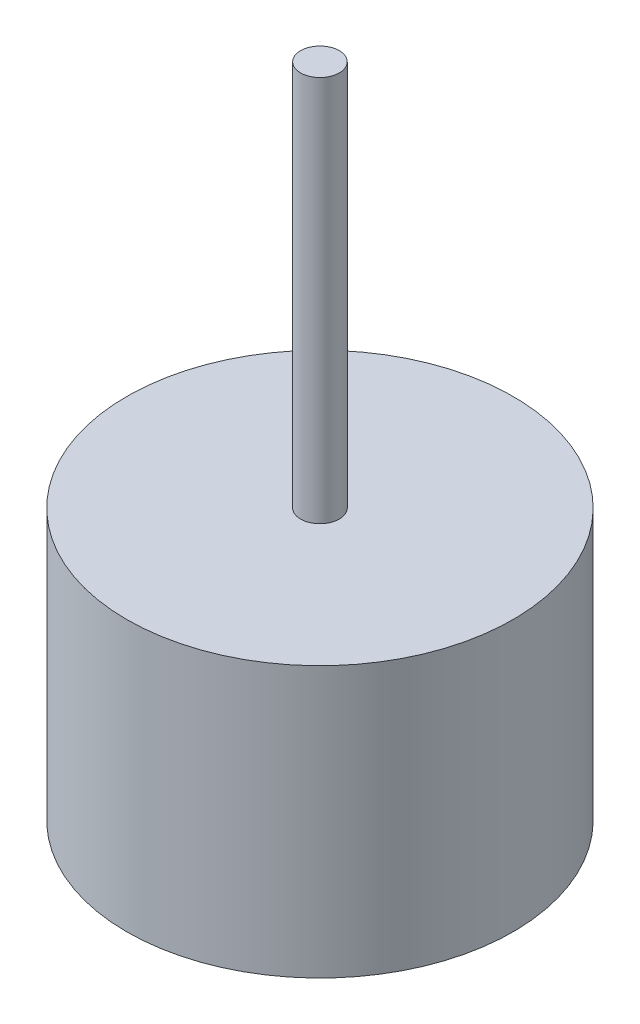
ISO-10303-21;
HEADER;
FILE_DESCRIPTION(('STEP AP214'),'2;1');
FILE_NAME('part.step','',(''),(''),'','','');
FILE_SCHEMA(('AUTOMOTIVE_DESIGN { 1 0 10303 214 1 1 1 1 }'));
ENDSEC;
DATA;
#1=APPLICATION_CONTEXT('core data for automotive mechanical design processes');
#2=APPLICATION_PROTOCOL_DEFINITION('international standard','automotive_design',2000,#1);
#3=PRODUCT_CONTEXT('',#1,'mechanical');
#4=PRODUCT('Part','Part','',(#3));
#5=PRODUCT_RELATED_PRODUCT_CATEGORY('part','',(#4));
#6=PRODUCT_DEFINITION_FORMATION('','',#4);
#7=PRODUCT_DEFINITION_CONTEXT('part definition',#1,'design');
#8=PRODUCT_DEFINITION('design','',#6,#7);
#9=PRODUCT_DEFINITION_SHAPE('','',#8);
#10=(LENGTH_UNIT() NAMED_UNIT(*) SI_UNIT(.MILLI.,.METRE.));
#11=(NAMED_UNIT(*) PLANE_ANGLE_UNIT() SI_UNIT($,.RADIAN.));
#12=(NAMED_UNIT(*) SI_UNIT($,.STERADIAN.) SOLID_ANGLE_UNIT());
#13=UNCERTAINTY_MEASURE_WITH_UNIT(LENGTH_MEASURE(1.E-05),#10,'distance_accuracy_value','');
#14=(GEOMETRIC_REPRESENTATION_CONTEXT(3) GLOBAL_UNCERTAINTY_ASSIGNED_CONTEXT((#13)) GLOBAL_UNIT_ASSIGNED_CONTEXT((#10,
#11,#12)) REPRESENTATION_CONTEXT('',''));
#15=CARTESIAN_POINT('',(0.,0.,0.));
#16=DIRECTION('',(0.,0.,1.));
#17=DIRECTION('',(1.,0.,0.));
#18=AXIS2_PLACEMENT_3D('',#15,#16,#17);
#19=CARTESIAN_POINT('',(0.,7.,0.));
#20=DIRECTION('',(0.,1.,0.));
#21=DIRECTION('',(0.,0.,1.));
#22=AXIS2_PLACEMENT_3D('',#19,#20,#21);
#23=PLANE('',#22);
#24=CARTESIAN_POINT('',(0.,7.,0.));
#25=DIRECTION('',(0.,1.,0.));
#26=DIRECTION('',(0.,0.,1.));
#27=AXIS2_PLACEMENT_3D('',#24,#25,#26);
#28=CIRCLE('',#27,5.);
#29=CARTESIAN_POINT('',(0.,7.,5.));
#30=VERTEX_POINT('',#29);
#31=EDGE_CURVE('E10',#30,#30,#28,.T.);
#32=ORIENTED_EDGE('',*,*,#31,.T.);
#33=EDGE_LOOP('',(#32));
#34=FACE_BOUND('',#33,.T.);
#35=CARTESIAN_POINT('',(0.,7.,0.));
#36=DIRECTION('',(0.,1.,0.));
#37=DIRECTION('',(0.,0.,1.));
#38=AXIS2_PLACEMENT_3D('',#35,#36,#37);
#39=CIRCLE('',#38,0.5);
#40=CARTESIAN_POINT('',(0.,7.,0.5));
#41=VERTEX_POINT('',#40);
#42=EDGE_CURVE('E42',#41,#41,#39,.T.);
#43=ORIENTED_EDGE('',*,*,#42,.F.);
#44=EDGE_LOOP('',(#43));
#45=FACE_BOUND('',#44,.T.);
#46=ADVANCED_FACE('F29',(#34,#45),#23,.T.);
#47=CARTESIAN_POINT('',(0.,7.,0.));
#48=DIRECTION('',(0.,-1.,0.));
#49=DIRECTION('',(0.,0.,-1.));
#50=AXIS2_PLACEMENT_3D('',#47,#48,#49);
#51=CYLINDRICAL_SURFACE('',#50,5.);
#52=ORIENTED_EDGE('',*,*,#31,.F.);
#53=EDGE_LOOP('',(#52));
#54=FACE_BOUND('',#53,.T.);
#55=CARTESIAN_POINT('',(0.,0.,0.));
#56=DIRECTION('',(0.,1.,0.));
#57=DIRECTION('',(0.,0.,1.));
#58=AXIS2_PLACEMENT_3D('',#55,#56,#57);
#59=CIRCLE('',#58,5.);
#60=CARTESIAN_POINT('',(0.,0.,5.));
#61=VERTEX_POINT('',#60);
#62=EDGE_CURVE('E33',#61,#61,#59,.T.);
#63=ORIENTED_EDGE('',*,*,#62,.T.);
#64=EDGE_LOOP('',(#63));
#65=FACE_BOUND('',#64,.T.);
#66=ADVANCED_FACE('F31',(#54,#65),#51,.T.);
#67=CARTESIAN_POINT('',(0.,0.,0.));
#68=DIRECTION('',(0.,1.,0.));
#69=DIRECTION('',(0.,0.,1.));
#70=AXIS2_PLACEMENT_3D('',#67,#68,#69);
#71=PLANE('',#70);
#72=ORIENTED_EDGE('',*,*,#62,.F.);
#73=EDGE_LOOP('',(#72));
#74=FACE_BOUND('',#73,.T.);
#75=ADVANCED_FACE('F53',(#74),#71,.F.);
#76=CARTESIAN_POINT('',(0.,17.,0.));
#77=DIRECTION('',(0.,-1.,0.));
#78=DIRECTION('',(0.,0.,-1.));
#79=AXIS2_PLACEMENT_3D('',#76,#77,#78);
#80=CYLINDRICAL_SURFACE('',#79,0.5);
#81=CARTESIAN_POINT('',(0.,17.,0.));
#82=DIRECTION('',(0.,1.,0.));
#83=DIRECTION('',(0.,0.,1.));
#84=AXIS2_PLACEMENT_3D('',#81,#82,#83);
#85=CIRCLE('',#84,0.5);
#86=CARTESIAN_POINT('',(0.,17.,0.5));
#87=VERTEX_POINT('',#86);
#88=EDGE_CURVE('E40',#87,#87,#85,.T.);
#89=ORIENTED_EDGE('',*,*,#88,.F.);
#90=EDGE_LOOP('',(#89));
#91=FACE_BOUND('',#90,.T.);
#92=ORIENTED_EDGE('',*,*,#42,.T.);
#93=EDGE_LOOP('',(#92));
#94=FACE_BOUND('',#93,.T.);
#95=ADVANCED_FACE('F50',(#91,#94),#80,.T.);
#96=CARTESIAN_POINT('',(0.,17.,0.));
#97=DIRECTION('',(0.,1.,0.));
#98=DIRECTION('',(0.,0.,1.));
#99=AXIS2_PLACEMENT_3D('',#96,#97,#98);
#100=PLANE('',#99);
#101=ORIENTED_EDGE('',*,*,#88,.T.);
#102=EDGE_LOOP('',(#101));
#103=FACE_BOUND('',#102,.T.);
#104=ADVANCED_FACE('F48',(#103),#100,.T.);
#105=CLOSED_SHELL('',(#46,#66,#75,#95,#104));
#106=MANIFOLD_SOLID_BREP('B2',#105);
#107=ADVANCED_BREP_SHAPE_REPRESENTATION('',(#18,#106),#14);
#108=SHAPE_DEFINITION_REPRESENTATION(#9,#107);
ENDSEC;
END-ISO-10303-21;
